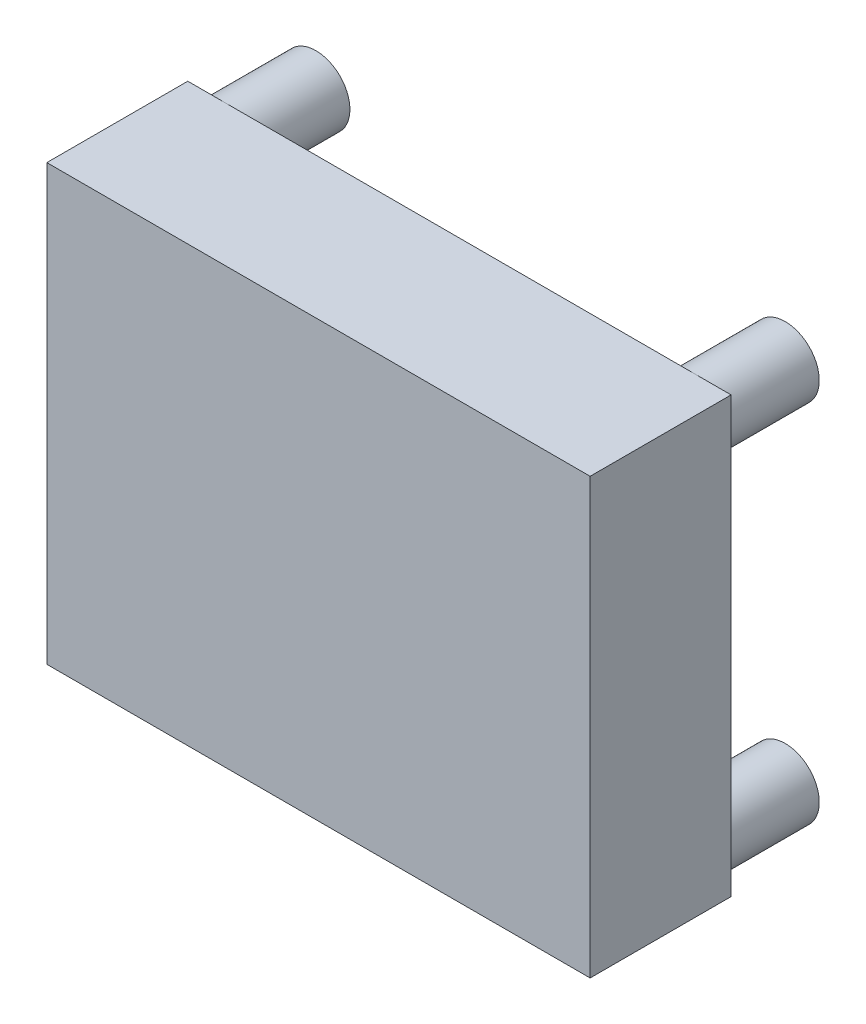
ISO-10303-21;
HEADER;
FILE_DESCRIPTION(('STEP AP214'),'2;1');
FILE_NAME('part.step','',(''),(''),'','','');
FILE_SCHEMA(('AUTOMOTIVE_DESIGN { 1 0 10303 214 1 1 1 1 }'));
ENDSEC;
DATA;
#1=APPLICATION_CONTEXT('core data for automotive mechanical design processes');
#2=APPLICATION_PROTOCOL_DEFINITION('international standard','automotive_design',2000,#1);
#3=PRODUCT_CONTEXT('',#1,'mechanical');
#4=PRODUCT('Part','Part','',(#3));
#5=PRODUCT_RELATED_PRODUCT_CATEGORY('part','',(#4));
#6=PRODUCT_DEFINITION_FORMATION('','',#4);
#7=PRODUCT_DEFINITION_CONTEXT('part definition',#1,'design');
#8=PRODUCT_DEFINITION('design','',#6,#7);
#9=PRODUCT_DEFINITION_SHAPE('','',#8);
#10=(LENGTH_UNIT() NAMED_UNIT(*) SI_UNIT(.MILLI.,.METRE.));
#11=(NAMED_UNIT(*) PLANE_ANGLE_UNIT() SI_UNIT($,.RADIAN.));
#12=(NAMED_UNIT(*) SI_UNIT($,.STERADIAN.) SOLID_ANGLE_UNIT());
#13=UNCERTAINTY_MEASURE_WITH_UNIT(LENGTH_MEASURE(1.E-05),#10,'distance_accuracy_value','');
#14=(GEOMETRIC_REPRESENTATION_CONTEXT(3) GLOBAL_UNCERTAINTY_ASSIGNED_CONTEXT((#13)) GLOBAL_UNIT_ASSIGNED_CONTEXT((#10,
#11,#12)) REPRESENTATION_CONTEXT('',''));
#15=CARTESIAN_POINT('',(0.,0.,0.));
#16=DIRECTION('',(0.,0.,1.));
#17=DIRECTION('',(1.,0.,0.));
#18=AXIS2_PLACEMENT_3D('',#15,#16,#17);
#19=CARTESIAN_POINT('',(0.,0.,0.));
#20=DIRECTION('',(0.,0.,-1.));
#21=DIRECTION('',(-1.,0.,0.));
#22=AXIS2_PLACEMENT_3D('',#19,#20,#21);
#23=PLANE('',#22);
#24=CARTESIAN_POINT('',(53.1876,3.6322,0.));
#25=DIRECTION('',(0.,0.,-1.));
#26=DIRECTION('',(-1.,0.,0.));
#27=AXIS2_PLACEMENT_3D('',#24,#25,#26);
#28=CIRCLE('',#27,3.5687);
#29=CARTESIAN_POINT('',(49.6189,3.6322,0.));
#30=VERTEX_POINT('',#29);
#31=EDGE_CURVE('E123',#30,#30,#28,.T.);
#32=ORIENTED_EDGE('',*,*,#31,.F.);
#33=EDGE_LOOP('',(#32));
#34=FACE_BOUND('',#33,.T.);
#35=CARTESIAN_POINT('',(3.8862,42.0116,0.));
#36=DIRECTION('',(0.,0.,-1.));
#37=DIRECTION('',(-1.,0.,0.));
#38=AXIS2_PLACEMENT_3D('',#35,#36,#37);
#39=CIRCLE('',#38,3.5687);
#40=CARTESIAN_POINT('',(0.317499999999998,42.0116,0.));
#41=VERTEX_POINT('',#40);
#42=EDGE_CURVE('E111',#41,#41,#39,.T.);
#43=ORIENTED_EDGE('',*,*,#42,.F.);
#44=EDGE_LOOP('',(#43));
#45=FACE_BOUND('',#44,.T.);
#46=DIRECTION('',(0.,-1.,0.));
#47=VECTOR('',#46,1.);
#48=CARTESIAN_POINT('',(0.,0.,0.));
#49=LINE('',#48,#47);
#50=CARTESIAN_POINT('',(0.,45.6438,0.));
#51=VERTEX_POINT('',#50);
#52=CARTESIAN_POINT('',(0.,0.,0.));
#53=VERTEX_POINT('',#52);
#54=EDGE_CURVE('E97',#51,#53,#49,.T.);
#55=ORIENTED_EDGE('',*,*,#54,.F.);
#56=DIRECTION('',(-1.,0.,0.));
#57=VECTOR('',#56,1.);
#58=CARTESIAN_POINT('',(0.,45.6438,0.));
#59=LINE('',#58,#57);
#60=CARTESIAN_POINT('',(57.0738,45.6438,0.));
#61=VERTEX_POINT('',#60);
#62=EDGE_CURVE('E73',#61,#51,#59,.T.);
#63=ORIENTED_EDGE('',*,*,#62,.F.);
#64=DIRECTION('',(0.,1.,0.));
#65=VECTOR('',#64,1.);
#66=CARTESIAN_POINT('',(57.0738,0.,0.));
#67=LINE('',#66,#65);
#68=CARTESIAN_POINT('',(57.0738,0.,0.));
#69=VERTEX_POINT('',#68);
#70=EDGE_CURVE('E67',#69,#61,#67,.T.);
#71=ORIENTED_EDGE('',*,*,#70,.F.);
#72=DIRECTION('',(1.,0.,0.));
#73=VECTOR('',#72,1.);
#74=CARTESIAN_POINT('',(0.,0.,0.));
#75=LINE('',#74,#73);
#76=EDGE_CURVE('E89',#53,#69,#75,.T.);
#77=ORIENTED_EDGE('',*,*,#76,.F.);
#78=EDGE_LOOP('',(#55,#63,#71,#77));
#79=FACE_BOUND('',#78,.T.);
#80=CARTESIAN_POINT('',(3.8862,3.6322,0.));
#81=DIRECTION('',(0.,0.,-1.));
#82=DIRECTION('',(-1.,0.,0.));
#83=AXIS2_PLACEMENT_3D('',#80,#81,#82);
#84=CIRCLE('',#83,3.5687);
#85=CARTESIAN_POINT('',(0.317499999999999,3.6322,0.));
#86=VERTEX_POINT('',#85);
#87=EDGE_CURVE('E117',#86,#86,#84,.T.);
#88=ORIENTED_EDGE('',*,*,#87,.F.);
#89=EDGE_LOOP('',(#88));
#90=FACE_BOUND('',#89,.T.);
#91=CARTESIAN_POINT('',(53.1876,42.0116,0.));
#92=DIRECTION('',(0.,0.,-1.));
#93=DIRECTION('',(-1.,0.,0.));
#94=AXIS2_PLACEMENT_3D('',#91,#92,#93);
#95=CIRCLE('',#94,3.5687);
#96=CARTESIAN_POINT('',(49.6189,42.0116,0.));
#97=VERTEX_POINT('',#96);
#98=EDGE_CURVE('E129',#97,#97,#95,.T.);
#99=ORIENTED_EDGE('',*,*,#98,.F.);
#100=EDGE_LOOP('',(#99));
#101=FACE_BOUND('',#100,.T.);
#102=ADVANCED_FACE('F33',(#34,#45,#79,#90,#101),#23,.T.);
#103=CARTESIAN_POINT('',(0.,0.,14.8082));
#104=DIRECTION('',(1.,0.,0.));
#105=DIRECTION('',(0.,0.,-1.));
#106=AXIS2_PLACEMENT_3D('',#103,#104,#105);
#107=PLANE('',#106);
#108=ORIENTED_EDGE('',*,*,#54,.T.);
#109=DIRECTION('',(0.,0.,-1.));
#110=VECTOR('',#109,1.);
#111=CARTESIAN_POINT('',(0.,0.,14.8082));
#112=LINE('',#111,#110);
#113=CARTESIAN_POINT('',(0.,0.,14.8082));
#114=VERTEX_POINT('',#113);
#115=EDGE_CURVE('E11',#114,#53,#112,.T.);
#116=ORIENTED_EDGE('',*,*,#115,.F.);
#117=DIRECTION('',(0.,-1.,0.));
#118=VECTOR('',#117,1.);
#119=CARTESIAN_POINT('',(0.,0.,14.8082));
#120=LINE('',#119,#118);
#121=CARTESIAN_POINT('',(0.,45.6438,14.8082));
#122=VERTEX_POINT('',#121);
#123=EDGE_CURVE('E85',#122,#114,#120,.T.);
#124=ORIENTED_EDGE('',*,*,#123,.F.);
#125=DIRECTION('',(0.,0.,-1.));
#126=VECTOR('',#125,1.);
#127=CARTESIAN_POINT('',(0.,45.6438,14.8082));
#128=LINE('',#127,#126);
#129=EDGE_CURVE('E93',#122,#51,#128,.T.);
#130=ORIENTED_EDGE('',*,*,#129,.T.);
#131=EDGE_LOOP('',(#108,#116,#124,#130));
#132=FACE_BOUND('',#131,.T.);
#133=ADVANCED_FACE('F35',(#132),#107,.F.);
#134=CARTESIAN_POINT('',(0.,0.,14.8082));
#135=DIRECTION('',(0.,1.,0.));
#136=DIRECTION('',(0.,0.,1.));
#137=AXIS2_PLACEMENT_3D('',#134,#135,#136);
#138=PLANE('',#137);
#139=ORIENTED_EDGE('',*,*,#76,.T.);
#140=DIRECTION('',(0.,0.,-1.));
#141=VECTOR('',#140,1.);
#142=CARTESIAN_POINT('',(57.0738,0.,14.8082));
#143=LINE('',#142,#141);
#144=CARTESIAN_POINT('',(57.0738,0.,14.8082));
#145=VERTEX_POINT('',#144);
#146=EDGE_CURVE('E42',#145,#69,#143,.T.);
#147=ORIENTED_EDGE('',*,*,#146,.F.);
#148=DIRECTION('',(1.,0.,0.));
#149=VECTOR('',#148,1.);
#150=CARTESIAN_POINT('',(0.,0.,14.8082));
#151=LINE('',#150,#149);
#152=EDGE_CURVE('E80',#114,#145,#151,.T.);
#153=ORIENTED_EDGE('',*,*,#152,.F.);
#154=ORIENTED_EDGE('',*,*,#115,.T.);
#155=EDGE_LOOP('',(#139,#147,#153,#154));
#156=FACE_BOUND('',#155,.T.);
#157=ADVANCED_FACE('F88',(#156),#138,.F.);
#158=CARTESIAN_POINT('',(57.0738,0.,14.8082));
#159=DIRECTION('',(-1.,0.,0.));
#160=DIRECTION('',(0.,0.,1.));
#161=AXIS2_PLACEMENT_3D('',#158,#159,#160);
#162=PLANE('',#161);
#163=ORIENTED_EDGE('',*,*,#70,.T.);
#164=DIRECTION('',(0.,0.,-1.));
#165=VECTOR('',#164,1.);
#166=CARTESIAN_POINT('',(57.0738,45.6438,14.8082));
#167=LINE('',#166,#165);
#168=CARTESIAN_POINT('',(57.0738,45.6438,14.8082));
#169=VERTEX_POINT('',#168);
#170=EDGE_CURVE('E90',#169,#61,#167,.T.);
#171=ORIENTED_EDGE('',*,*,#170,.F.);
#172=DIRECTION('',(0.,1.,0.));
#173=VECTOR('',#172,1.);
#174=CARTESIAN_POINT('',(57.0738,0.,14.8082));
#175=LINE('',#174,#173);
#176=EDGE_CURVE('E83',#145,#169,#175,.T.);
#177=ORIENTED_EDGE('',*,*,#176,.F.);
#178=ORIENTED_EDGE('',*,*,#146,.T.);
#179=EDGE_LOOP('',(#163,#171,#177,#178));
#180=FACE_BOUND('',#179,.T.);
#181=ADVANCED_FACE('F91',(#180),#162,.F.);
#182=CARTESIAN_POINT('',(0.,45.6438,14.8082));
#183=DIRECTION('',(0.,-1.,0.));
#184=DIRECTION('',(0.,0.,-1.));
#185=AXIS2_PLACEMENT_3D('',#182,#183,#184);
#186=PLANE('',#185);
#187=ORIENTED_EDGE('',*,*,#62,.T.);
#188=ORIENTED_EDGE('',*,*,#129,.F.);
#189=DIRECTION('',(-1.,0.,0.));
#190=VECTOR('',#189,1.);
#191=CARTESIAN_POINT('',(0.,45.6438,14.8082));
#192=LINE('',#191,#190);
#193=EDGE_CURVE('E50',#169,#122,#192,.T.);
#194=ORIENTED_EDGE('',*,*,#193,.F.);
#195=ORIENTED_EDGE('',*,*,#170,.T.);
#196=EDGE_LOOP('',(#187,#188,#194,#195));
#197=FACE_BOUND('',#196,.T.);
#198=ADVANCED_FACE('F105',(#197),#186,.F.);
#199=CARTESIAN_POINT('',(0.,0.,14.8082));
#200=DIRECTION('',(0.,0.,-1.));
#201=DIRECTION('',(-1.,0.,0.));
#202=AXIS2_PLACEMENT_3D('',#199,#200,#201);
#203=PLANE('',#202);
#204=ORIENTED_EDGE('',*,*,#123,.T.);
#205=ORIENTED_EDGE('',*,*,#152,.T.);
#206=ORIENTED_EDGE('',*,*,#176,.T.);
#207=ORIENTED_EDGE('',*,*,#193,.T.);
#208=EDGE_LOOP('',(#204,#205,#206,#207));
#209=FACE_BOUND('',#208,.T.);
#210=ADVANCED_FACE('F81',(#209),#203,.F.);
#211=CARTESIAN_POINT('',(3.8862,42.0116,-9.5758));
#212=DIRECTION('',(0.,0.,1.));
#213=DIRECTION('',(1.,0.,0.));
#214=AXIS2_PLACEMENT_3D('',#211,#212,#213);
#215=CYLINDRICAL_SURFACE('',#214,3.5687);
#216=CARTESIAN_POINT('',(3.8862,42.0116,-9.5758));
#217=DIRECTION('',(0.,0.,-1.));
#218=DIRECTION('',(-1.,0.,0.));
#219=AXIS2_PLACEMENT_3D('',#216,#217,#218);
#220=CIRCLE('',#219,3.5687);
#221=CARTESIAN_POINT('',(0.317499999999998,42.0116,-9.5758));
#222=VERTEX_POINT('',#221);
#223=EDGE_CURVE('E100',#222,#222,#220,.T.);
#224=ORIENTED_EDGE('',*,*,#223,.F.);
#225=EDGE_LOOP('',(#224));
#226=FACE_BOUND('',#225,.T.);
#227=ORIENTED_EDGE('',*,*,#42,.T.);
#228=EDGE_LOOP('',(#227));
#229=FACE_BOUND('',#228,.T.);
#230=ADVANCED_FACE('F172',(#226,#229),#215,.T.);
#231=CARTESIAN_POINT('',(3.8862,42.0116,-9.5758));
#232=DIRECTION('',(0.,0.,-1.));
#233=DIRECTION('',(-1.,0.,0.));
#234=AXIS2_PLACEMENT_3D('',#231,#232,#233);
#235=PLANE('',#234);
#236=CARTESIAN_POINT('',(3.8862,42.0116,-9.5758));
#237=DIRECTION('',(0.,0.,-1.));
#238=DIRECTION('',(-1.,0.,0.));
#239=AXIS2_PLACEMENT_3D('',#236,#237,#238);
#240=CIRCLE('',#239,1.3462);
#241=CARTESIAN_POINT('',(2.54,42.0116,-9.5758));
#242=VERTEX_POINT('',#241);
#243=EDGE_CURVE('E153',#242,#242,#240,.T.);
#244=ORIENTED_EDGE('',*,*,#243,.F.);
#245=EDGE_LOOP('',(#244));
#246=FACE_BOUND('',#245,.T.);
#247=ORIENTED_EDGE('',*,*,#223,.T.);
#248=EDGE_LOOP('',(#247));
#249=FACE_BOUND('',#248,.T.);
#250=ADVANCED_FACE('F168',(#246,#249),#235,.T.);
#251=CARTESIAN_POINT('',(3.8862,3.6322,-9.5758));
#252=DIRECTION('',(0.,0.,1.));
#253=DIRECTION('',(1.,0.,0.));
#254=AXIS2_PLACEMENT_3D('',#251,#252,#253);
#255=CYLINDRICAL_SURFACE('',#254,3.5687);
#256=CARTESIAN_POINT('',(3.8862,3.6322,-9.5758));
#257=DIRECTION('',(0.,0.,-1.));
#258=DIRECTION('',(-1.,0.,0.));
#259=AXIS2_PLACEMENT_3D('',#256,#257,#258);
#260=CIRCLE('',#259,3.5687);
#261=CARTESIAN_POINT('',(0.317499999999999,3.6322,-9.5758));
#262=VERTEX_POINT('',#261);
#263=EDGE_CURVE('E114',#262,#262,#260,.T.);
#264=ORIENTED_EDGE('',*,*,#263,.F.);
#265=EDGE_LOOP('',(#264));
#266=FACE_BOUND('',#265,.T.);
#267=ORIENTED_EDGE('',*,*,#87,.T.);
#268=EDGE_LOOP('',(#267));
#269=FACE_BOUND('',#268,.T.);
#270=ADVANCED_FACE('F171',(#266,#269),#255,.T.);
#271=CARTESIAN_POINT('',(3.8862,3.6322,-9.5758));
#272=DIRECTION('',(0.,0.,-1.));
#273=DIRECTION('',(-1.,0.,0.));
#274=AXIS2_PLACEMENT_3D('',#271,#272,#273);
#275=PLANE('',#274);
#276=CARTESIAN_POINT('',(3.8862,3.6322,-9.5758));
#277=DIRECTION('',(0.,0.,-1.));
#278=DIRECTION('',(-1.,0.,0.));
#279=AXIS2_PLACEMENT_3D('',#276,#277,#278);
#280=CIRCLE('',#279,1.3462);
#281=CARTESIAN_POINT('',(2.54,3.6322,-9.5758));
#282=VERTEX_POINT('',#281);
#283=EDGE_CURVE('E135',#282,#282,#280,.T.);
#284=ORIENTED_EDGE('',*,*,#283,.F.);
#285=EDGE_LOOP('',(#284));
#286=FACE_BOUND('',#285,.T.);
#287=ORIENTED_EDGE('',*,*,#263,.T.);
#288=EDGE_LOOP('',(#287));
#289=FACE_BOUND('',#288,.T.);
#290=ADVANCED_FACE('F227',(#286,#289),#275,.T.);
#291=CARTESIAN_POINT('',(53.1876,3.6322,-9.5758));
#292=DIRECTION('',(0.,0.,1.));
#293=DIRECTION('',(1.,0.,0.));
#294=AXIS2_PLACEMENT_3D('',#291,#292,#293);
#295=CYLINDRICAL_SURFACE('',#294,3.5687);
#296=CARTESIAN_POINT('',(53.1876,3.6322,-9.5758));
#297=DIRECTION('',(0.,0.,-1.));
#298=DIRECTION('',(-1.,0.,0.));
#299=AXIS2_PLACEMENT_3D('',#296,#297,#298);
#300=CIRCLE('',#299,3.5687);
#301=CARTESIAN_POINT('',(49.6189,3.6322,-9.5758));
#302=VERTEX_POINT('',#301);
#303=EDGE_CURVE('E120',#302,#302,#300,.T.);
#304=ORIENTED_EDGE('',*,*,#303,.F.);
#305=EDGE_LOOP('',(#304));
#306=FACE_BOUND('',#305,.T.);
#307=ORIENTED_EDGE('',*,*,#31,.T.);
#308=EDGE_LOOP('',(#307));
#309=FACE_BOUND('',#308,.T.);
#310=ADVANCED_FACE('F235',(#306,#309),#295,.T.);
#311=CARTESIAN_POINT('',(53.1876,3.6322,-9.5758));
#312=DIRECTION('',(0.,0.,-1.));
#313=DIRECTION('',(-1.,0.,0.));
#314=AXIS2_PLACEMENT_3D('',#311,#312,#313);
#315=PLANE('',#314);
#316=CARTESIAN_POINT('',(53.1876,3.6322,-9.5758));
#317=DIRECTION('',(0.,0.,-1.));
#318=DIRECTION('',(-1.,0.,0.));
#319=AXIS2_PLACEMENT_3D('',#316,#317,#318);
#320=CIRCLE('',#319,1.3462);
#321=CARTESIAN_POINT('',(51.8414,3.6322,-9.5758));
#322=VERTEX_POINT('',#321);
#323=EDGE_CURVE('E141',#322,#322,#320,.T.);
#324=ORIENTED_EDGE('',*,*,#323,.F.);
#325=EDGE_LOOP('',(#324));
#326=FACE_BOUND('',#325,.T.);
#327=ORIENTED_EDGE('',*,*,#303,.T.);
#328=EDGE_LOOP('',(#327));
#329=FACE_BOUND('',#328,.T.);
#330=ADVANCED_FACE('F243',(#326,#329),#315,.T.);
#331=CARTESIAN_POINT('',(53.1876,42.0116,-9.5758));
#332=DIRECTION('',(0.,0.,1.));
#333=DIRECTION('',(1.,0.,0.));
#334=AXIS2_PLACEMENT_3D('',#331,#332,#333);
#335=CYLINDRICAL_SURFACE('',#334,3.5687);
#336=CARTESIAN_POINT('',(53.1876,42.0116,-9.5758));
#337=DIRECTION('',(0.,0.,-1.));
#338=DIRECTION('',(-1.,0.,0.));
#339=AXIS2_PLACEMENT_3D('',#336,#337,#338);
#340=CIRCLE('',#339,3.5687);
#341=CARTESIAN_POINT('',(49.6189,42.0116,-9.5758));
#342=VERTEX_POINT('',#341);
#343=EDGE_CURVE('E126',#342,#342,#340,.T.);
#344=ORIENTED_EDGE('',*,*,#343,.F.);
#345=EDGE_LOOP('',(#344));
#346=FACE_BOUND('',#345,.T.);
#347=ORIENTED_EDGE('',*,*,#98,.T.);
#348=EDGE_LOOP('',(#347));
#349=FACE_BOUND('',#348,.T.);
#350=ADVANCED_FACE('F250',(#346,#349),#335,.T.);
#351=CARTESIAN_POINT('',(53.1876,42.0116,-9.5758));
#352=DIRECTION('',(0.,0.,-1.));
#353=DIRECTION('',(-1.,0.,0.));
#354=AXIS2_PLACEMENT_3D('',#351,#352,#353);
#355=PLANE('',#354);
#356=CARTESIAN_POINT('',(53.1876,42.0116,-9.5758));
#357=DIRECTION('',(0.,0.,-1.));
#358=DIRECTION('',(-1.,0.,0.));
#359=AXIS2_PLACEMENT_3D('',#356,#357,#358);
#360=CIRCLE('',#359,1.3462);
#361=CARTESIAN_POINT('',(51.8414,42.0116,-9.5758));
#362=VERTEX_POINT('',#361);
#363=EDGE_CURVE('E147',#362,#362,#360,.T.);
#364=ORIENTED_EDGE('',*,*,#363,.F.);
#365=EDGE_LOOP('',(#364));
#366=FACE_BOUND('',#365,.T.);
#367=ORIENTED_EDGE('',*,*,#343,.T.);
#368=EDGE_LOOP('',(#367));
#369=FACE_BOUND('',#368,.T.);
#370=ADVANCED_FACE('F258',(#366,#369),#355,.T.);
#371=CARTESIAN_POINT('',(3.8862,3.6322,-0.685800000000002));
#372=DIRECTION('',(0.,0.,-1.));
#373=DIRECTION('',(-1.,0.,0.));
#374=AXIS2_PLACEMENT_3D('',#371,#372,#373);
#375=CYLINDRICAL_SURFACE('',#374,1.3462);
#376=CARTESIAN_POINT('',(3.8862,3.6322,-0.685800000000002));
#377=DIRECTION('',(0.,0.,-1.));
#378=DIRECTION('',(-1.,0.,0.));
#379=AXIS2_PLACEMENT_3D('',#376,#377,#378);
#380=CIRCLE('',#379,1.3462);
#381=CARTESIAN_POINT('',(2.54,3.6322,-0.685800000000002));
#382=VERTEX_POINT('',#381);
#383=EDGE_CURVE('E132',#382,#382,#380,.T.);
#384=ORIENTED_EDGE('',*,*,#383,.F.);
#385=EDGE_LOOP('',(#384));
#386=FACE_BOUND('',#385,.T.);
#387=ORIENTED_EDGE('',*,*,#283,.T.);
#388=EDGE_LOOP('',(#387));
#389=FACE_BOUND('',#388,.T.);
#390=ADVANCED_FACE('F265',(#386,#389),#375,.F.);
#391=CARTESIAN_POINT('',(3.8862,3.6322,-0.685800000000002));
#392=DIRECTION('',(0.,0.,-1.));
#393=DIRECTION('',(-1.,0.,0.));
#394=AXIS2_PLACEMENT_3D('',#391,#392,#393);
#395=PLANE('',#394);
#396=ORIENTED_EDGE('',*,*,#383,.T.);
#397=EDGE_LOOP('',(#396));
#398=FACE_BOUND('',#397,.T.);
#399=ADVANCED_FACE('F273',(#398),#395,.T.);
#400=CARTESIAN_POINT('',(53.1876,3.6322,-0.685800000000002));
#401=DIRECTION('',(0.,0.,-1.));
#402=DIRECTION('',(-1.,0.,0.));
#403=AXIS2_PLACEMENT_3D('',#400,#401,#402);
#404=CYLINDRICAL_SURFACE('',#403,1.3462);
#405=CARTESIAN_POINT('',(53.1876,3.6322,-0.685800000000002));
#406=DIRECTION('',(0.,0.,-1.));
#407=DIRECTION('',(-1.,0.,0.));
#408=AXIS2_PLACEMENT_3D('',#405,#406,#407);
#409=CIRCLE('',#408,1.3462);
#410=CARTESIAN_POINT('',(51.8414,3.6322,-0.685800000000002));
#411=VERTEX_POINT('',#410);
#412=EDGE_CURVE('E138',#411,#411,#409,.T.);
#413=ORIENTED_EDGE('',*,*,#412,.F.);
#414=EDGE_LOOP('',(#413));
#415=FACE_BOUND('',#414,.T.);
#416=ORIENTED_EDGE('',*,*,#323,.T.);
#417=EDGE_LOOP('',(#416));
#418=FACE_BOUND('',#417,.T.);
#419=ADVANCED_FACE('F281',(#415,#418),#404,.F.);
#420=CARTESIAN_POINT('',(53.1876,3.6322,-0.685800000000002));
#421=DIRECTION('',(0.,0.,-1.));
#422=DIRECTION('',(-1.,0.,0.));
#423=AXIS2_PLACEMENT_3D('',#420,#421,#422);
#424=PLANE('',#423);
#425=ORIENTED_EDGE('',*,*,#412,.T.);
#426=EDGE_LOOP('',(#425));
#427=FACE_BOUND('',#426,.T.);
#428=ADVANCED_FACE('F289',(#427),#424,.T.);
#429=CARTESIAN_POINT('',(53.1876,42.0116,-0.685800000000002));
#430=DIRECTION('',(0.,0.,-1.));
#431=DIRECTION('',(-1.,0.,0.));
#432=AXIS2_PLACEMENT_3D('',#429,#430,#431);
#433=CYLINDRICAL_SURFACE('',#432,1.3462);
#434=CARTESIAN_POINT('',(53.1876,42.0116,-0.685800000000002));
#435=DIRECTION('',(0.,0.,-1.));
#436=DIRECTION('',(-1.,0.,0.));
#437=AXIS2_PLACEMENT_3D('',#434,#435,#436);
#438=CIRCLE('',#437,1.3462);
#439=CARTESIAN_POINT('',(51.8414,42.0116,-0.685800000000002));
#440=VERTEX_POINT('',#439);
#441=EDGE_CURVE('E144',#440,#440,#438,.T.);
#442=ORIENTED_EDGE('',*,*,#441,.F.);
#443=EDGE_LOOP('',(#442));
#444=FACE_BOUND('',#443,.T.);
#445=ORIENTED_EDGE('',*,*,#363,.T.);
#446=EDGE_LOOP('',(#445));
#447=FACE_BOUND('',#446,.T.);
#448=ADVANCED_FACE('F297',(#444,#447),#433,.F.);
#449=CARTESIAN_POINT('',(53.1876,42.0116,-0.685800000000002));
#450=DIRECTION('',(0.,0.,-1.));
#451=DIRECTION('',(-1.,0.,0.));
#452=AXIS2_PLACEMENT_3D('',#449,#450,#451);
#453=PLANE('',#452);
#454=ORIENTED_EDGE('',*,*,#441,.T.);
#455=EDGE_LOOP('',(#454));
#456=FACE_BOUND('',#455,.T.);
#457=ADVANCED_FACE('F164',(#456),#453,.T.);
#458=CARTESIAN_POINT('',(3.8862,42.0116,-0.685800000000002));
#459=DIRECTION('',(0.,0.,-1.));
#460=DIRECTION('',(-1.,0.,0.));
#461=AXIS2_PLACEMENT_3D('',#458,#459,#460);
#462=CYLINDRICAL_SURFACE('',#461,1.3462);
#463=CARTESIAN_POINT('',(3.8862,42.0116,-0.685800000000002));
#464=DIRECTION('',(0.,0.,-1.));
#465=DIRECTION('',(-1.,0.,0.));
#466=AXIS2_PLACEMENT_3D('',#463,#464,#465);
#467=CIRCLE('',#466,1.3462);
#468=CARTESIAN_POINT('',(2.54,42.0116,-0.685800000000002));
#469=VERTEX_POINT('',#468);
#470=EDGE_CURVE('E150',#469,#469,#467,.T.);
#471=ORIENTED_EDGE('',*,*,#470,.F.);
#472=EDGE_LOOP('',(#471));
#473=FACE_BOUND('',#472,.T.);
#474=ORIENTED_EDGE('',*,*,#243,.T.);
#475=EDGE_LOOP('',(#474));
#476=FACE_BOUND('',#475,.T.);
#477=ADVANCED_FACE('F161',(#473,#476),#462,.F.);
#478=CARTESIAN_POINT('',(3.8862,42.0116,-0.685800000000002));
#479=DIRECTION('',(0.,0.,-1.));
#480=DIRECTION('',(-1.,0.,0.));
#481=AXIS2_PLACEMENT_3D('',#478,#479,#480);
#482=PLANE('',#481);
#483=ORIENTED_EDGE('',*,*,#470,.T.);
#484=EDGE_LOOP('',(#483));
#485=FACE_BOUND('',#484,.T.);
#486=ADVANCED_FACE('F159',(#485),#482,.T.);
#487=CLOSED_SHELL('',(#102,#133,#157,#181,#198,#210,#230,#250,#270,#290,#310,#330,#350,#370,
#390,#399,#419,#428,#448,#457,#477,#486));
#488=MANIFOLD_SOLID_BREP('B2',#487);
#489=ADVANCED_BREP_SHAPE_REPRESENTATION('',(#18,#488),#14);
#490=SHAPE_DEFINITION_REPRESENTATION(#9,#489);
ENDSEC;
END-ISO-10303-21;
